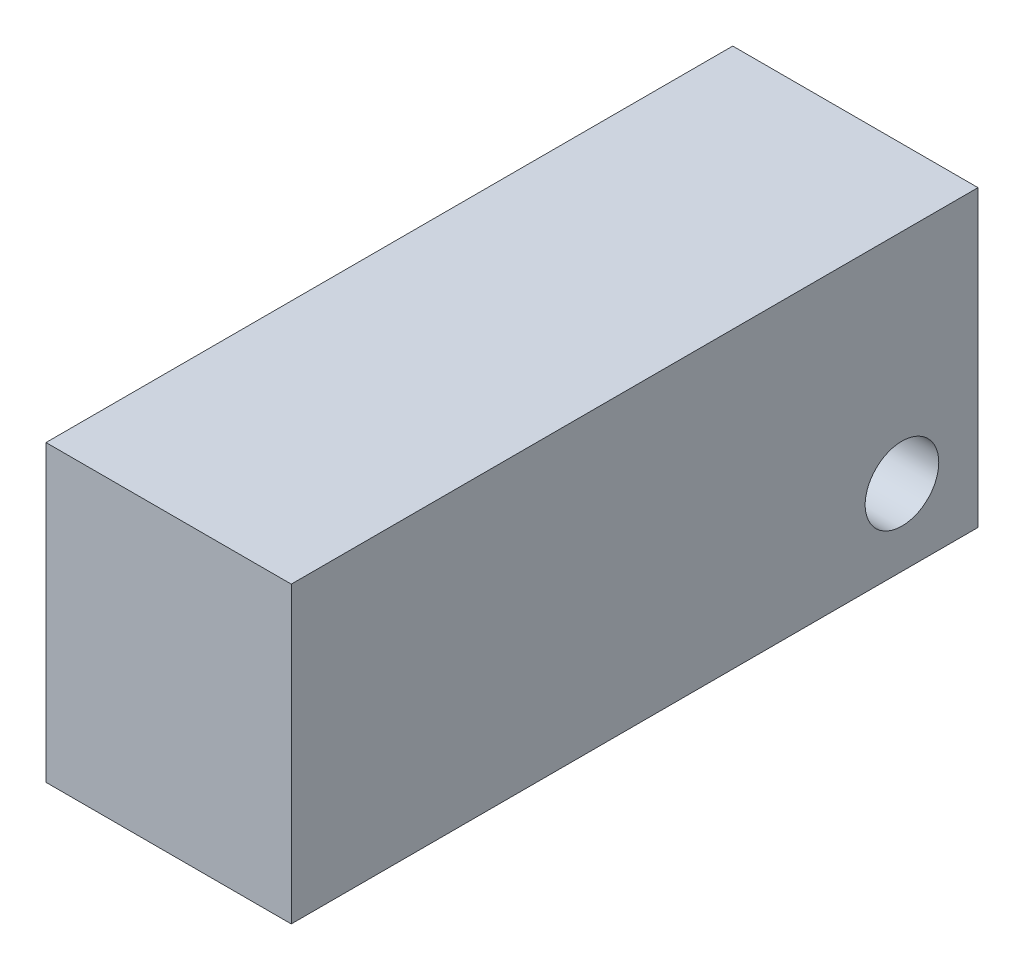
ISO-10303-21;
HEADER;
FILE_DESCRIPTION(('STEP AP214'),'2;1');
FILE_NAME('part.step','',(''),(''),'','','');
FILE_SCHEMA(('AUTOMOTIVE_DESIGN { 1 0 10303 214 1 1 1 1 }'));
ENDSEC;
DATA;
#1=APPLICATION_CONTEXT('core data for automotive mechanical design processes');
#2=APPLICATION_PROTOCOL_DEFINITION('international standard','automotive_design',2000,#1);
#3=PRODUCT_CONTEXT('',#1,'mechanical');
#4=PRODUCT('Part','Part','',(#3));
#5=PRODUCT_RELATED_PRODUCT_CATEGORY('part','',(#4));
#6=PRODUCT_DEFINITION_FORMATION('','',#4);
#7=PRODUCT_DEFINITION_CONTEXT('part definition',#1,'design');
#8=PRODUCT_DEFINITION('design','',#6,#7);
#9=PRODUCT_DEFINITION_SHAPE('','',#8);
#10=(LENGTH_UNIT() NAMED_UNIT(*) SI_UNIT(.MILLI.,.METRE.));
#11=(NAMED_UNIT(*) PLANE_ANGLE_UNIT() SI_UNIT($,.RADIAN.));
#12=(NAMED_UNIT(*) SI_UNIT($,.STERADIAN.) SOLID_ANGLE_UNIT());
#13=UNCERTAINTY_MEASURE_WITH_UNIT(LENGTH_MEASURE(1.E-05),#10,'distance_accuracy_value','');
#14=(GEOMETRIC_REPRESENTATION_CONTEXT(3) GLOBAL_UNCERTAINTY_ASSIGNED_CONTEXT((#13)) GLOBAL_UNIT_ASSIGNED_CONTEXT((#10,
#11,#12)) REPRESENTATION_CONTEXT('',''));
#15=CARTESIAN_POINT('',(0.,0.,0.));
#16=DIRECTION('',(0.,0.,1.));
#17=DIRECTION('',(1.,0.,0.));
#18=AXIS2_PLACEMENT_3D('',#15,#16,#17);
#19=CARTESIAN_POINT('',(10.,0.,0.));
#20=DIRECTION('',(1.,0.,0.));
#21=DIRECTION('',(0.,0.,-1.));
#22=AXIS2_PLACEMENT_3D('',#19,#20,#21);
#23=PLANE('',#22);
#24=DIRECTION('',(0.,1.,0.));
#25=VECTOR('',#24,1.);
#26=CARTESIAN_POINT('',(10.,0.,0.));
#27=LINE('',#26,#25);
#28=CARTESIAN_POINT('',(10.,0.,0.));
#29=VERTEX_POINT('',#28);
#30=CARTESIAN_POINT('',(10.,12.,0.));
#31=VERTEX_POINT('',#30);
#32=EDGE_CURVE('E96',#29,#31,#27,.T.);
#33=ORIENTED_EDGE('',*,*,#32,.T.);
#34=DIRECTION('',(0.,0.,1.));
#35=VECTOR('',#34,1.);
#36=CARTESIAN_POINT('',(10.,12.,0.));
#37=LINE('',#36,#35);
#38=CARTESIAN_POINT('',(10.,12.,28.));
#39=VERTEX_POINT('',#38);
#40=EDGE_CURVE('E91',#31,#39,#37,.T.);
#41=ORIENTED_EDGE('',*,*,#40,.T.);
#42=DIRECTION('',(0.,-1.,0.));
#43=VECTOR('',#42,1.);
#44=CARTESIAN_POINT('',(10.,0.,28.));
#45=LINE('',#44,#43);
#46=CARTESIAN_POINT('',(10.,0.,28.));
#47=VERTEX_POINT('',#46);
#48=EDGE_CURVE('E94',#39,#47,#45,.T.);
#49=ORIENTED_EDGE('',*,*,#48,.T.);
#50=DIRECTION('',(0.,0.,-1.));
#51=VECTOR('',#50,1.);
#52=CARTESIAN_POINT('',(10.,0.,0.));
#53=LINE('',#52,#51);
#54=EDGE_CURVE('E61',#47,#29,#53,.T.);
#55=ORIENTED_EDGE('',*,*,#54,.T.);
#56=EDGE_LOOP('',(#33,#41,#49,#55));
#57=FACE_BOUND('',#56,.T.);
#58=CARTESIAN_POINT('',(10.,3.1,3.1));
#59=DIRECTION('',(1.,0.,0.));
#60=DIRECTION('',(0.,0.,-1.));
#61=AXIS2_PLACEMENT_3D('',#58,#59,#60);
#62=CIRCLE('',#61,1.5);
#63=CARTESIAN_POINT('',(10.,3.1,1.6));
#64=VERTEX_POINT('',#63);
#65=EDGE_CURVE('E116',#64,#64,#62,.T.);
#66=ORIENTED_EDGE('',*,*,#65,.F.);
#67=EDGE_LOOP('',(#66));
#68=FACE_BOUND('',#67,.T.);
#69=ADVANCED_FACE('F43',(#57,#68),#23,.T.);
#70=CARTESIAN_POINT('',(0.,0.,0.));
#71=DIRECTION('',(1.,0.,0.));
#72=DIRECTION('',(0.,0.,-1.));
#73=AXIS2_PLACEMENT_3D('',#70,#71,#72);
#74=PLANE('',#73);
#75=DIRECTION('',(0.,1.,0.));
#76=VECTOR('',#75,1.);
#77=CARTESIAN_POINT('',(0.,0.,0.));
#78=LINE('',#77,#76);
#79=CARTESIAN_POINT('',(0.,0.,0.));
#80=VERTEX_POINT('',#79);
#81=CARTESIAN_POINT('',(0.,12.,0.));
#82=VERTEX_POINT('',#81);
#83=EDGE_CURVE('E112',#80,#82,#78,.T.);
#84=ORIENTED_EDGE('',*,*,#83,.F.);
#85=DIRECTION('',(0.,0.,-1.));
#86=VECTOR('',#85,1.);
#87=CARTESIAN_POINT('',(0.,0.,0.));
#88=LINE('',#87,#86);
#89=CARTESIAN_POINT('',(0.,0.,28.));
#90=VERTEX_POINT('',#89);
#91=EDGE_CURVE('E84',#90,#80,#88,.T.);
#92=ORIENTED_EDGE('',*,*,#91,.F.);
#93=DIRECTION('',(0.,-1.,0.));
#94=VECTOR('',#93,1.);
#95=CARTESIAN_POINT('',(0.,0.,28.));
#96=LINE('',#95,#94);
#97=CARTESIAN_POINT('',(0.,12.,28.));
#98=VERTEX_POINT('',#97);
#99=EDGE_CURVE('E78',#98,#90,#96,.T.);
#100=ORIENTED_EDGE('',*,*,#99,.F.);
#101=DIRECTION('',(0.,0.,1.));
#102=VECTOR('',#101,1.);
#103=CARTESIAN_POINT('',(0.,12.,0.));
#104=LINE('',#103,#102);
#105=EDGE_CURVE('E101',#82,#98,#104,.T.);
#106=ORIENTED_EDGE('',*,*,#105,.F.);
#107=EDGE_LOOP('',(#84,#92,#100,#106));
#108=FACE_BOUND('',#107,.T.);
#109=CARTESIAN_POINT('',(0.,3.1,3.1));
#110=DIRECTION('',(1.,0.,0.));
#111=DIRECTION('',(0.,0.,-1.));
#112=AXIS2_PLACEMENT_3D('',#109,#110,#111);
#113=CIRCLE('',#112,1.5);
#114=CARTESIAN_POINT('',(0.,3.1,1.6));
#115=VERTEX_POINT('',#114);
#116=EDGE_CURVE('E134',#115,#115,#113,.T.);
#117=ORIENTED_EDGE('',*,*,#116,.T.);
#118=EDGE_LOOP('',(#117));
#119=FACE_BOUND('',#118,.T.);
#120=ADVANCED_FACE('F129',(#108,#119),#74,.F.);
#121=CARTESIAN_POINT('',(10.,0.,0.));
#122=DIRECTION('',(0.,0.,1.));
#123=DIRECTION('',(0.,-1.,0.));
#124=AXIS2_PLACEMENT_3D('',#121,#122,#123);
#125=PLANE('',#124);
#126=ORIENTED_EDGE('',*,*,#83,.T.);
#127=DIRECTION('',(-1.,0.,0.));
#128=VECTOR('',#127,1.);
#129=CARTESIAN_POINT('',(10.,12.,0.));
#130=LINE('',#129,#128);
#131=EDGE_CURVE('E11',#31,#82,#130,.T.);
#132=ORIENTED_EDGE('',*,*,#131,.F.);
#133=ORIENTED_EDGE('',*,*,#32,.F.);
#134=DIRECTION('',(-1.,0.,0.));
#135=VECTOR('',#134,1.);
#136=CARTESIAN_POINT('',(10.,0.,0.));
#137=LINE('',#136,#135);
#138=EDGE_CURVE('E108',#29,#80,#137,.T.);
#139=ORIENTED_EDGE('',*,*,#138,.T.);
#140=EDGE_LOOP('',(#126,#132,#133,#139));
#141=FACE_BOUND('',#140,.T.);
#142=ADVANCED_FACE('F45',(#141),#125,.F.);
#143=CARTESIAN_POINT('',(10.,12.,0.));
#144=DIRECTION('',(0.,-1.,0.));
#145=DIRECTION('',(0.,0.,-1.));
#146=AXIS2_PLACEMENT_3D('',#143,#144,#145);
#147=PLANE('',#146);
#148=ORIENTED_EDGE('',*,*,#105,.T.);
#149=DIRECTION('',(-1.,0.,0.));
#150=VECTOR('',#149,1.);
#151=CARTESIAN_POINT('',(10.,12.,28.));
#152=LINE('',#151,#150);
#153=EDGE_CURVE('E53',#39,#98,#152,.T.);
#154=ORIENTED_EDGE('',*,*,#153,.F.);
#155=ORIENTED_EDGE('',*,*,#40,.F.);
#156=ORIENTED_EDGE('',*,*,#131,.T.);
#157=EDGE_LOOP('',(#148,#154,#155,#156));
#158=FACE_BOUND('',#157,.T.);
#159=ADVANCED_FACE('F100',(#158),#147,.F.);
#160=CARTESIAN_POINT('',(10.,0.,28.));
#161=DIRECTION('',(0.,0.,-1.));
#162=DIRECTION('',(-1.,0.,0.));
#163=AXIS2_PLACEMENT_3D('',#160,#161,#162);
#164=PLANE('',#163);
#165=ORIENTED_EDGE('',*,*,#99,.T.);
#166=DIRECTION('',(-1.,0.,0.));
#167=VECTOR('',#166,1.);
#168=CARTESIAN_POINT('',(10.,0.,28.));
#169=LINE('',#168,#167);
#170=EDGE_CURVE('E103',#47,#90,#169,.T.);
#171=ORIENTED_EDGE('',*,*,#170,.F.);
#172=ORIENTED_EDGE('',*,*,#48,.F.);
#173=ORIENTED_EDGE('',*,*,#153,.T.);
#174=EDGE_LOOP('',(#165,#171,#172,#173));
#175=FACE_BOUND('',#174,.T.);
#176=ADVANCED_FACE('F104',(#175),#164,.F.);
#177=CARTESIAN_POINT('',(10.,0.,0.));
#178=DIRECTION('',(0.,1.,0.));
#179=DIRECTION('',(0.,0.,1.));
#180=AXIS2_PLACEMENT_3D('',#177,#178,#179);
#181=PLANE('',#180);
#182=ORIENTED_EDGE('',*,*,#91,.T.);
#183=ORIENTED_EDGE('',*,*,#138,.F.);
#184=ORIENTED_EDGE('',*,*,#54,.F.);
#185=ORIENTED_EDGE('',*,*,#170,.T.);
#186=EDGE_LOOP('',(#182,#183,#184,#185));
#187=FACE_BOUND('',#186,.T.);
#188=ADVANCED_FACE('F126',(#187),#181,.F.);
#189=CARTESIAN_POINT('',(10.,3.1,3.1));
#190=DIRECTION('',(-1.,0.,0.));
#191=DIRECTION('',(0.,0.,1.));
#192=AXIS2_PLACEMENT_3D('',#189,#190,#191);
#193=CYLINDRICAL_SURFACE('',#192,1.5);
#194=ORIENTED_EDGE('',*,*,#65,.T.);
#195=EDGE_LOOP('',(#194));
#196=FACE_BOUND('',#195,.T.);
#197=ORIENTED_EDGE('',*,*,#116,.F.);
#198=EDGE_LOOP('',(#197));
#199=FACE_BOUND('',#198,.T.);
#200=ADVANCED_FACE('F142',(#196,#199),#193,.F.);
#201=CLOSED_SHELL('',(#69,#120,#142,#159,#176,#188,#200));
#202=MANIFOLD_SOLID_BREP('B2',#201);
#203=ADVANCED_BREP_SHAPE_REPRESENTATION('',(#18,#202),#14);
#204=SHAPE_DEFINITION_REPRESENTATION(#9,#203);
ENDSEC;
END-ISO-10303-21;
